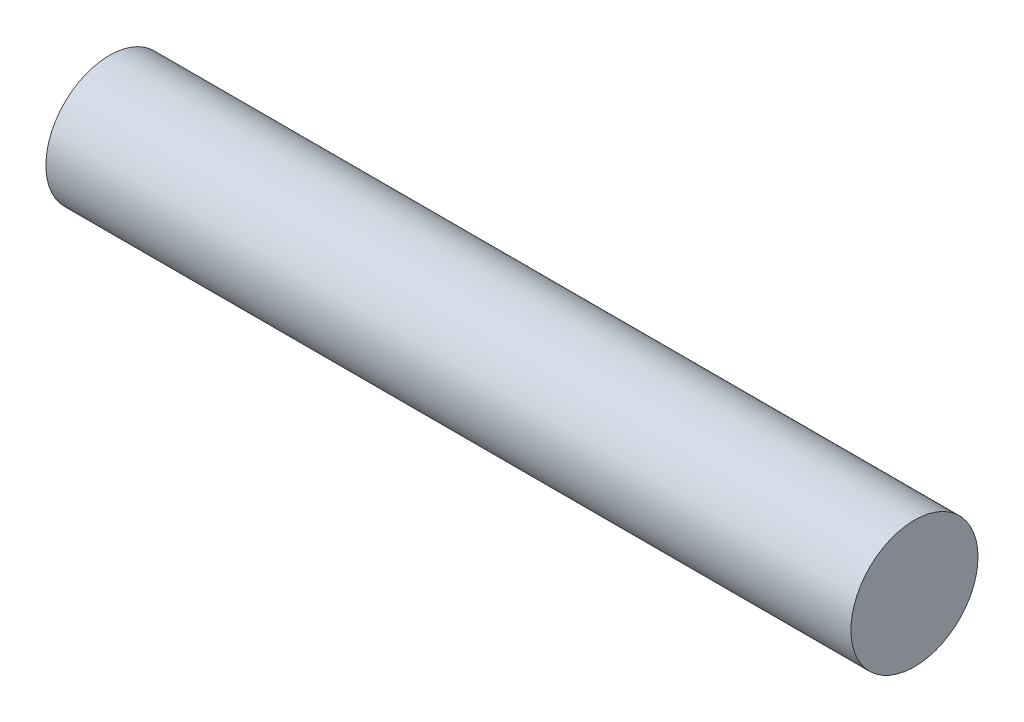
ISO-10303-21;
HEADER;
FILE_DESCRIPTION(('STEP AP214'),'2;1');
FILE_NAME('part.step','',(''),(''),'','','');
FILE_SCHEMA(('AUTOMOTIVE_DESIGN { 1 0 10303 214 1 1 1 1 }'));
ENDSEC;
DATA;
#1=APPLICATION_CONTEXT('core data for automotive mechanical design processes');
#2=APPLICATION_PROTOCOL_DEFINITION('international standard','automotive_design',2000,#1);
#3=PRODUCT_CONTEXT('',#1,'mechanical');
#4=PRODUCT('Part','Part','',(#3));
#5=PRODUCT_RELATED_PRODUCT_CATEGORY('part','',(#4));
#6=PRODUCT_DEFINITION_FORMATION('','',#4);
#7=PRODUCT_DEFINITION_CONTEXT('part definition',#1,'design');
#8=PRODUCT_DEFINITION('design','',#6,#7);
#9=PRODUCT_DEFINITION_SHAPE('','',#8);
#10=(LENGTH_UNIT() NAMED_UNIT(*) SI_UNIT(.MILLI.,.METRE.));
#11=(NAMED_UNIT(*) PLANE_ANGLE_UNIT() SI_UNIT($,.RADIAN.));
#12=(NAMED_UNIT(*) SI_UNIT($,.STERADIAN.) SOLID_ANGLE_UNIT());
#13=UNCERTAINTY_MEASURE_WITH_UNIT(LENGTH_MEASURE(1.E-05),#10,'distance_accuracy_value','');
#14=(GEOMETRIC_REPRESENTATION_CONTEXT(3) GLOBAL_UNCERTAINTY_ASSIGNED_CONTEXT((#13)) GLOBAL_UNIT_ASSIGNED_CONTEXT((#10,
#11,#12)) REPRESENTATION_CONTEXT('',''));
#15=CARTESIAN_POINT('',(0.,0.,0.));
#16=DIRECTION('',(0.,0.,1.));
#17=DIRECTION('',(1.,0.,0.));
#18=AXIS2_PLACEMENT_3D('',#15,#16,#17);
#19=CARTESIAN_POINT('',(19.,0.,0.));
#20=DIRECTION('',(-1.,0.,0.));
#21=DIRECTION('',(0.,0.,1.));
#22=AXIS2_PLACEMENT_3D('',#19,#20,#21);
#23=CYLINDRICAL_SURFACE('',#22,3.);
#24=CARTESIAN_POINT('',(19.,0.,0.));
#25=DIRECTION('',(1.,0.,0.));
#26=DIRECTION('',(0.,0.,-1.));
#27=AXIS2_PLACEMENT_3D('',#24,#25,#26);
#28=CIRCLE('',#27,3.);
#29=CARTESIAN_POINT('',(19.,0.,-3.));
#30=VERTEX_POINT('',#29);
#31=EDGE_CURVE('E10',#30,#30,#28,.T.);
#32=ORIENTED_EDGE('',*,*,#31,.F.);
#33=EDGE_LOOP('',(#32));
#34=FACE_BOUND('',#33,.T.);
#35=CARTESIAN_POINT('',(-19.,0.,0.));
#36=DIRECTION('',(1.,0.,0.));
#37=DIRECTION('',(0.,0.,-1.));
#38=AXIS2_PLACEMENT_3D('',#35,#36,#37);
#39=CIRCLE('',#38,3.);
#40=CARTESIAN_POINT('',(-19.,0.,-3.));
#41=VERTEX_POINT('',#40);
#42=EDGE_CURVE('E46',#41,#41,#39,.T.);
#43=ORIENTED_EDGE('',*,*,#42,.T.);
#44=EDGE_LOOP('',(#43));
#45=FACE_BOUND('',#44,.T.);
#46=ADVANCED_FACE('F43',(#34,#45),#23,.T.);
#47=CARTESIAN_POINT('',(19.,0.,0.));
#48=DIRECTION('',(1.,0.,0.));
#49=DIRECTION('',(0.,0.,-1.));
#50=AXIS2_PLACEMENT_3D('',#47,#48,#49);
#51=PLANE('',#50);
#52=ORIENTED_EDGE('',*,*,#31,.T.);
#53=EDGE_LOOP('',(#52));
#54=FACE_BOUND('',#53,.T.);
#55=ADVANCED_FACE('F60',(#54),#51,.T.);
#56=CARTESIAN_POINT('',(-19.,0.,0.));
#57=DIRECTION('',(1.,0.,0.));
#58=DIRECTION('',(0.,0.,-1.));
#59=AXIS2_PLACEMENT_3D('',#56,#57,#58);
#60=PLANE('',#59);
#61=ORIENTED_EDGE('',*,*,#42,.F.);
#62=EDGE_LOOP('',(#61));
#63=FACE_BOUND('',#62,.T.);
#64=ADVANCED_FACE('F58',(#63),#60,.F.);
#65=CLOSED_SHELL('',(#46,#55,#64));
#66=MANIFOLD_SOLID_BREP('B2',#65);
#67=ADVANCED_BREP_SHAPE_REPRESENTATION('',(#18,#66),#14);
#68=SHAPE_DEFINITION_REPRESENTATION(#9,#67);
ENDSEC;
END-ISO-10303-21;
